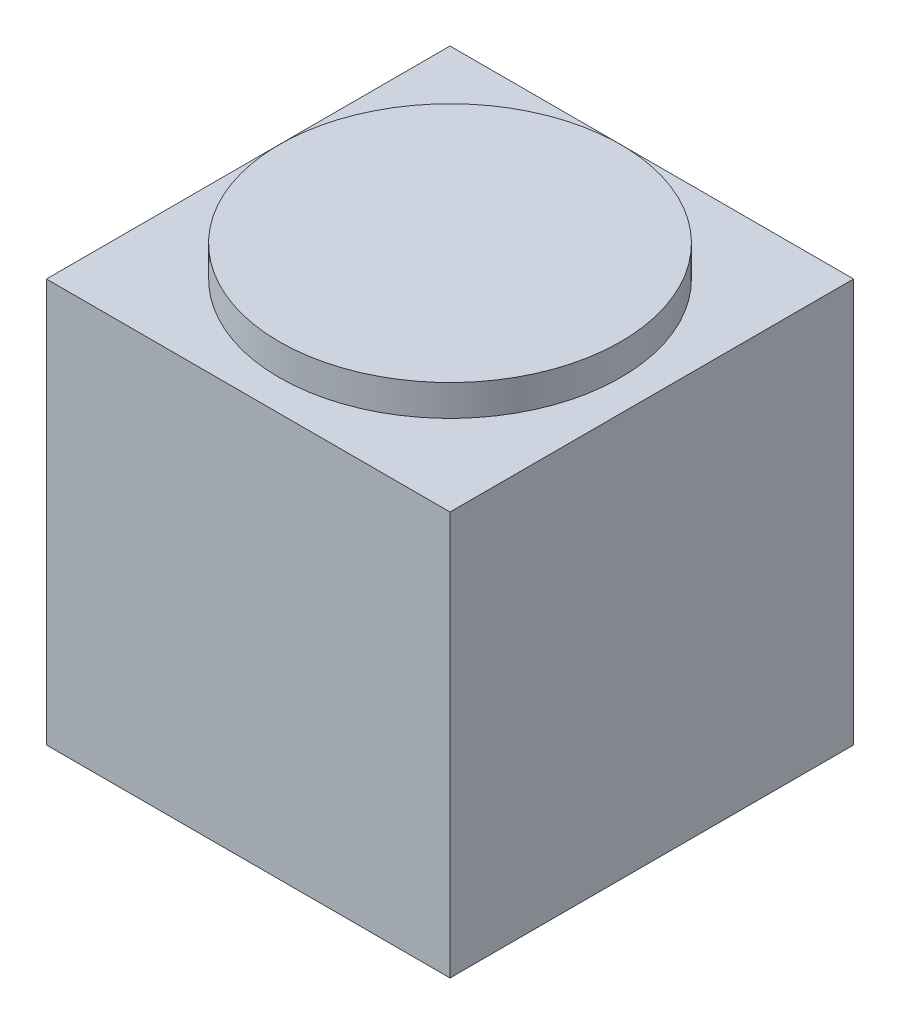
ISO-10303-21;
HEADER;
FILE_DESCRIPTION(('STEP AP214'),'2;1');
FILE_NAME('part.step','',(''),(''),'','','');
FILE_SCHEMA(('AUTOMOTIVE_DESIGN { 1 0 10303 214 1 1 1 1 }'));
ENDSEC;
DATA;
#1=APPLICATION_CONTEXT('core data for automotive mechanical design processes');
#2=APPLICATION_PROTOCOL_DEFINITION('international standard','automotive_design',2000,#1);
#3=PRODUCT_CONTEXT('',#1,'mechanical');
#4=PRODUCT('Part','Part','',(#3));
#5=PRODUCT_RELATED_PRODUCT_CATEGORY('part','',(#4));
#6=PRODUCT_DEFINITION_FORMATION('','',#4);
#7=PRODUCT_DEFINITION_CONTEXT('part definition',#1,'design');
#8=PRODUCT_DEFINITION('design','',#6,#7);
#9=PRODUCT_DEFINITION_SHAPE('','',#8);
#10=(LENGTH_UNIT() NAMED_UNIT(*) SI_UNIT(.MILLI.,.METRE.));
#11=(NAMED_UNIT(*) PLANE_ANGLE_UNIT() SI_UNIT($,.RADIAN.));
#12=(NAMED_UNIT(*) SI_UNIT($,.STERADIAN.) SOLID_ANGLE_UNIT());
#13=UNCERTAINTY_MEASURE_WITH_UNIT(LENGTH_MEASURE(1.E-05),#10,'distance_accuracy_value','');
#14=(GEOMETRIC_REPRESENTATION_CONTEXT(3) GLOBAL_UNCERTAINTY_ASSIGNED_CONTEXT((#13)) GLOBAL_UNIT_ASSIGNED_CONTEXT((#10,
#11,#12)) REPRESENTATION_CONTEXT('',''));
#15=CARTESIAN_POINT('',(0.,0.,0.));
#16=DIRECTION('',(0.,0.,1.));
#17=DIRECTION('',(1.,0.,0.));
#18=AXIS2_PLACEMENT_3D('',#15,#16,#17);
#19=CARTESIAN_POINT('',(-65.,65.,-65.));
#20=DIRECTION('',(1.,0.,0.));
#21=DIRECTION('',(0.,0.,-1.));
#22=AXIS2_PLACEMENT_3D('',#19,#20,#21);
#23=PLANE('',#22);
#24=DIRECTION('',(0.,0.,1.));
#25=VECTOR('',#24,1.);
#26=CARTESIAN_POINT('',(-65.,-65.,-65.));
#27=LINE('',#26,#25);
#28=CARTESIAN_POINT('',(-65.,-65.,-65.));
#29=VERTEX_POINT('',#28);
#30=CARTESIAN_POINT('',(-65.,-65.,65.));
#31=VERTEX_POINT('',#30);
#32=EDGE_CURVE('E114',#29,#31,#27,.T.);
#33=ORIENTED_EDGE('',*,*,#32,.T.);
#34=DIRECTION('',(0.,-1.,0.));
#35=VECTOR('',#34,1.);
#36=CARTESIAN_POINT('',(-65.,65.,65.));
#37=LINE('',#36,#35);
#38=CARTESIAN_POINT('',(-65.,65.,65.));
#39=VERTEX_POINT('',#38);
#40=EDGE_CURVE('E46',#39,#31,#37,.T.);
#41=ORIENTED_EDGE('',*,*,#40,.F.);
#42=DIRECTION('',(0.,0.,1.));
#43=VECTOR('',#42,1.);
#44=CARTESIAN_POINT('',(-65.,65.,-65.));
#45=LINE('',#44,#43);
#46=CARTESIAN_POINT('',(-65.,65.,-65.));
#47=VERTEX_POINT('',#46);
#48=EDGE_CURVE('E97',#47,#39,#45,.T.);
#49=ORIENTED_EDGE('',*,*,#48,.F.);
#50=DIRECTION('',(0.,-1.,0.));
#51=VECTOR('',#50,1.);
#52=CARTESIAN_POINT('',(-65.,65.,-65.));
#53=LINE('',#52,#51);
#54=EDGE_CURVE('E110',#47,#29,#53,.T.);
#55=ORIENTED_EDGE('',*,*,#54,.T.);
#56=EDGE_LOOP('',(#33,#41,#49,#55));
#57=FACE_BOUND('',#56,.T.);
#58=ADVANCED_FACE('F43',(#57),#23,.F.);
#59=CARTESIAN_POINT('',(-65.,65.,65.));
#60=DIRECTION('',(0.,0.,-1.));
#61=DIRECTION('',(-1.,0.,0.));
#62=AXIS2_PLACEMENT_3D('',#59,#60,#61);
#63=PLANE('',#62);
#64=DIRECTION('',(1.,0.,0.));
#65=VECTOR('',#64,1.);
#66=CARTESIAN_POINT('',(-65.,-65.,65.));
#67=LINE('',#66,#65);
#68=CARTESIAN_POINT('',(65.,-65.,65.));
#69=VERTEX_POINT('',#68);
#70=EDGE_CURVE('E103',#31,#69,#67,.T.);
#71=ORIENTED_EDGE('',*,*,#70,.T.);
#72=DIRECTION('',(0.,-1.,0.));
#73=VECTOR('',#72,1.);
#74=CARTESIAN_POINT('',(65.,65.,65.));
#75=LINE('',#74,#73);
#76=CARTESIAN_POINT('',(65.,65.,65.));
#77=VERTEX_POINT('',#76);
#78=EDGE_CURVE('E101',#77,#69,#75,.T.);
#79=ORIENTED_EDGE('',*,*,#78,.F.);
#80=DIRECTION('',(1.,0.,0.));
#81=VECTOR('',#80,1.);
#82=CARTESIAN_POINT('',(-65.,65.,65.));
#83=LINE('',#82,#81);
#84=EDGE_CURVE('E92',#39,#77,#83,.T.);
#85=ORIENTED_EDGE('',*,*,#84,.F.);
#86=ORIENTED_EDGE('',*,*,#40,.T.);
#87=EDGE_LOOP('',(#71,#79,#85,#86));
#88=FACE_BOUND('',#87,.T.);
#89=ADVANCED_FACE('F102',(#88),#63,.F.);
#90=CARTESIAN_POINT('',(65.,65.,-65.));
#91=DIRECTION('',(-1.,0.,0.));
#92=DIRECTION('',(0.,0.,1.));
#93=AXIS2_PLACEMENT_3D('',#90,#91,#92);
#94=PLANE('',#93);
#95=DIRECTION('',(0.,0.,-1.));
#96=VECTOR('',#95,1.);
#97=CARTESIAN_POINT('',(65.,-65.,-65.));
#98=LINE('',#97,#96);
#99=CARTESIAN_POINT('',(65.,-65.,-65.));
#100=VERTEX_POINT('',#99);
#101=EDGE_CURVE('E78',#69,#100,#98,.T.);
#102=ORIENTED_EDGE('',*,*,#101,.T.);
#103=DIRECTION('',(0.,-1.,0.));
#104=VECTOR('',#103,1.);
#105=CARTESIAN_POINT('',(65.,65.,-65.));
#106=LINE('',#105,#104);
#107=CARTESIAN_POINT('',(65.,65.,-65.));
#108=VERTEX_POINT('',#107);
#109=EDGE_CURVE('E105',#108,#100,#106,.T.);
#110=ORIENTED_EDGE('',*,*,#109,.F.);
#111=DIRECTION('',(0.,0.,-1.));
#112=VECTOR('',#111,1.);
#113=CARTESIAN_POINT('',(65.,65.,-65.));
#114=LINE('',#113,#112);
#115=EDGE_CURVE('E95',#77,#108,#114,.T.);
#116=ORIENTED_EDGE('',*,*,#115,.F.);
#117=ORIENTED_EDGE('',*,*,#78,.T.);
#118=EDGE_LOOP('',(#102,#110,#116,#117));
#119=FACE_BOUND('',#118,.T.);
#120=ADVANCED_FACE('F106',(#119),#94,.F.);
#121=CARTESIAN_POINT('',(-65.,65.,-65.));
#122=DIRECTION('',(0.,0.,1.));
#123=DIRECTION('',(1.,0.,0.));
#124=AXIS2_PLACEMENT_3D('',#121,#122,#123);
#125=PLANE('',#124);
#126=DIRECTION('',(-1.,0.,0.));
#127=VECTOR('',#126,1.);
#128=CARTESIAN_POINT('',(-65.,-65.,-65.));
#129=LINE('',#128,#127);
#130=EDGE_CURVE('E84',#100,#29,#129,.T.);
#131=ORIENTED_EDGE('',*,*,#130,.T.);
#132=ORIENTED_EDGE('',*,*,#54,.F.);
#133=DIRECTION('',(-1.,0.,0.));
#134=VECTOR('',#133,1.);
#135=CARTESIAN_POINT('',(-65.,65.,-65.));
#136=LINE('',#135,#134);
#137=EDGE_CURVE('E61',#108,#47,#136,.T.);
#138=ORIENTED_EDGE('',*,*,#137,.F.);
#139=ORIENTED_EDGE('',*,*,#109,.T.);
#140=EDGE_LOOP('',(#131,#132,#138,#139));
#141=FACE_BOUND('',#140,.T.);
#142=ADVANCED_FACE('F128',(#141),#125,.F.);
#143=CARTESIAN_POINT('',(0.,65.,0.));
#144=DIRECTION('',(0.,1.,0.));
#145=DIRECTION('',(0.,0.,1.));
#146=AXIS2_PLACEMENT_3D('',#143,#144,#145);
#147=PLANE('',#146);
#148=CARTESIAN_POINT('',(0.,65.,0.));
#149=DIRECTION('',(0.,1.,0.));
#150=DIRECTION('',(0.,0.,1.));
#151=AXIS2_PLACEMENT_3D('',#148,#149,#150);
#152=CIRCLE('',#151,55.);
#153=CARTESIAN_POINT('',(0.,65.,55.));
#154=VERTEX_POINT('',#153);
#155=EDGE_CURVE('E11',#154,#154,#152,.T.);
#156=ORIENTED_EDGE('',*,*,#155,.F.);
#157=EDGE_LOOP('',(#156));
#158=FACE_BOUND('',#157,.T.);
#159=ORIENTED_EDGE('',*,*,#48,.T.);
#160=ORIENTED_EDGE('',*,*,#84,.T.);
#161=ORIENTED_EDGE('',*,*,#115,.T.);
#162=ORIENTED_EDGE('',*,*,#137,.T.);
#163=EDGE_LOOP('',(#159,#160,#161,#162));
#164=FACE_BOUND('',#163,.T.);
#165=ADVANCED_FACE('F93',(#158,#164),#147,.T.);
#166=CARTESIAN_POINT('',(0.,-65.,0.));
#167=DIRECTION('',(0.,1.,0.));
#168=DIRECTION('',(0.,0.,1.));
#169=AXIS2_PLACEMENT_3D('',#166,#167,#168);
#170=PLANE('',#169);
#171=ORIENTED_EDGE('',*,*,#32,.F.);
#172=ORIENTED_EDGE('',*,*,#130,.F.);
#173=ORIENTED_EDGE('',*,*,#101,.F.);
#174=ORIENTED_EDGE('',*,*,#70,.F.);
#175=EDGE_LOOP('',(#171,#172,#173,#174));
#176=FACE_BOUND('',#175,.T.);
#177=ADVANCED_FACE('F131',(#176),#170,.F.);
#178=CARTESIAN_POINT('',(0.,75.,0.));
#179=DIRECTION('',(0.,-1.,0.));
#180=DIRECTION('',(0.,0.,-1.));
#181=AXIS2_PLACEMENT_3D('',#178,#179,#180);
#182=CYLINDRICAL_SURFACE('',#181,55.);
#183=CARTESIAN_POINT('',(0.,75.,0.));
#184=DIRECTION('',(0.,1.,0.));
#185=DIRECTION('',(0.,0.,1.));
#186=AXIS2_PLACEMENT_3D('',#183,#184,#185);
#187=CIRCLE('',#186,55.);
#188=CARTESIAN_POINT('',(0.,75.,55.));
#189=VERTEX_POINT('',#188);
#190=EDGE_CURVE('E118',#189,#189,#187,.T.);
#191=ORIENTED_EDGE('',*,*,#190,.F.);
#192=EDGE_LOOP('',(#191));
#193=FACE_BOUND('',#192,.T.);
#194=ORIENTED_EDGE('',*,*,#155,.T.);
#195=EDGE_LOOP('',(#194));
#196=FACE_BOUND('',#195,.T.);
#197=ADVANCED_FACE('F141',(#193,#196),#182,.T.);
#198=CARTESIAN_POINT('',(0.,75.,0.));
#199=DIRECTION('',(0.,1.,0.));
#200=DIRECTION('',(0.,0.,1.));
#201=AXIS2_PLACEMENT_3D('',#198,#199,#200);
#202=PLANE('',#201);
#203=ORIENTED_EDGE('',*,*,#190,.T.);
#204=EDGE_LOOP('',(#203));
#205=FACE_BOUND('',#204,.T.);
#206=ADVANCED_FACE('F139',(#205),#202,.T.);
#207=CLOSED_SHELL('',(#58,#89,#120,#142,#165,#177,#197,#206));
#208=MANIFOLD_SOLID_BREP('B2',#207);
#209=ADVANCED_BREP_SHAPE_REPRESENTATION('',(#18,#208),#14);
#210=SHAPE_DEFINITION_REPRESENTATION(#9,#209);
ENDSEC;
END-ISO-10303-21;
